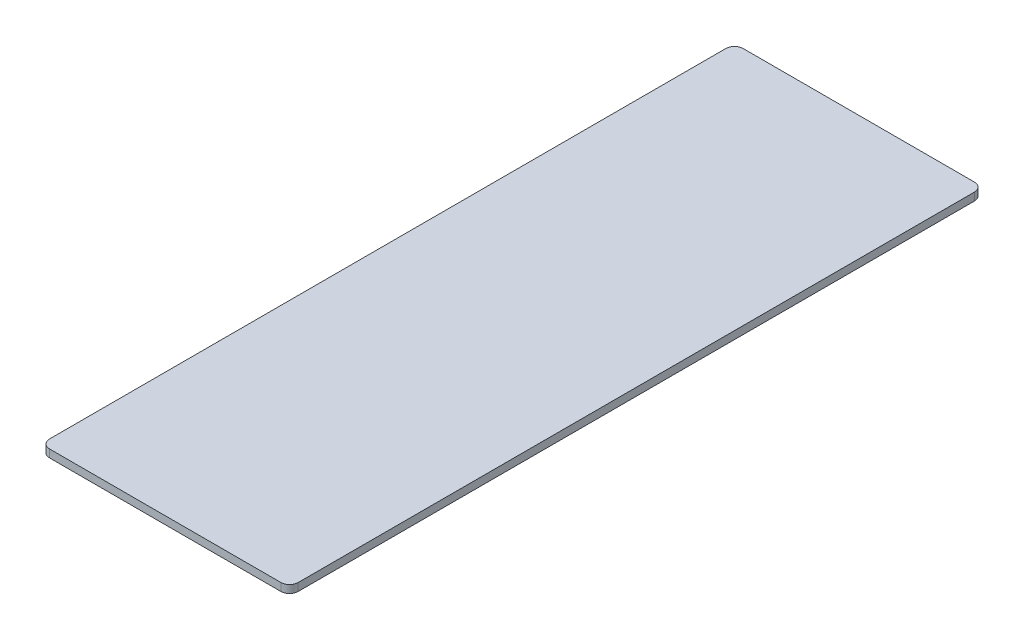
ISO-10303-21;
HEADER;
FILE_DESCRIPTION(('STEP AP214'),'2;1');
FILE_NAME('part.step','',(''),(''),'','','');
FILE_SCHEMA(('AUTOMOTIVE_DESIGN { 1 0 10303 214 1 1 1 1 }'));
ENDSEC;
DATA;
#1=APPLICATION_CONTEXT('core data for automotive mechanical design processes');
#2=APPLICATION_PROTOCOL_DEFINITION('international standard','automotive_design',2000,#1);
#3=PRODUCT_CONTEXT('',#1,'mechanical');
#4=PRODUCT('Part','Part','',(#3));
#5=PRODUCT_RELATED_PRODUCT_CATEGORY('part','',(#4));
#6=PRODUCT_DEFINITION_FORMATION('','',#4);
#7=PRODUCT_DEFINITION_CONTEXT('part definition',#1,'design');
#8=PRODUCT_DEFINITION('design','',#6,#7);
#9=PRODUCT_DEFINITION_SHAPE('','',#8);
#10=(LENGTH_UNIT() NAMED_UNIT(*) SI_UNIT(.MILLI.,.METRE.));
#11=(NAMED_UNIT(*) PLANE_ANGLE_UNIT() SI_UNIT($,.RADIAN.));
#12=(NAMED_UNIT(*) SI_UNIT($,.STERADIAN.) SOLID_ANGLE_UNIT());
#13=UNCERTAINTY_MEASURE_WITH_UNIT(LENGTH_MEASURE(1.E-05),#10,'distance_accuracy_value','');
#14=(GEOMETRIC_REPRESENTATION_CONTEXT(3) GLOBAL_UNCERTAINTY_ASSIGNED_CONTEXT((#13)) GLOBAL_UNIT_ASSIGNED_CONTEXT((#10,
#11,#12)) REPRESENTATION_CONTEXT('',''));
#15=CARTESIAN_POINT('',(0.,0.,0.));
#16=DIRECTION('',(0.,0.,1.));
#17=DIRECTION('',(1.,0.,0.));
#18=AXIS2_PLACEMENT_3D('',#15,#16,#17);
#19=CARTESIAN_POINT('',(0.,4.5,0.));
#20=DIRECTION('',(1.,0.,0.));
#21=DIRECTION('',(0.,0.,-1.));
#22=AXIS2_PLACEMENT_3D('',#19,#20,#21);
#23=PLANE('',#22);
#24=DIRECTION('',(0.,0.,1.));
#25=VECTOR('',#24,1.);
#26=CARTESIAN_POINT('',(0.,4.5,0.));
#27=LINE('',#26,#25);
#28=CARTESIAN_POINT('',(0.,4.5,-395.));
#29=VERTEX_POINT('',#28);
#30=CARTESIAN_POINT('',(0.,4.5,-5.));
#31=VERTEX_POINT('',#30);
#32=EDGE_CURVE('E133',#29,#31,#27,.T.);
#33=ORIENTED_EDGE('',*,*,#32,.F.);
#34=DIRECTION('',(0.,-1.,0.));
#35=VECTOR('',#34,1.);
#36=CARTESIAN_POINT('',(0.,4.5,-395.));
#37=LINE('',#36,#35);
#38=CARTESIAN_POINT('',(0.,0.,-395.));
#39=VERTEX_POINT('',#38);
#40=EDGE_CURVE('E117',#29,#39,#37,.T.);
#41=ORIENTED_EDGE('',*,*,#40,.T.);
#42=DIRECTION('',(0.,0.,1.));
#43=VECTOR('',#42,1.);
#44=CARTESIAN_POINT('',(0.,0.,0.));
#45=LINE('',#44,#43);
#46=CARTESIAN_POINT('',(0.,0.,-5.));
#47=VERTEX_POINT('',#46);
#48=EDGE_CURVE('E130',#39,#47,#45,.T.);
#49=ORIENTED_EDGE('',*,*,#48,.T.);
#50=DIRECTION('',(0.,-1.,0.));
#51=VECTOR('',#50,1.);
#52=CARTESIAN_POINT('',(0.,4.5,-5.));
#53=LINE('',#52,#51);
#54=EDGE_CURVE('E136',#47,#31,#53,.F.);
#55=ORIENTED_EDGE('',*,*,#54,.T.);
#56=EDGE_LOOP('',(#33,#41,#49,#55));
#57=FACE_BOUND('',#56,.T.);
#58=ADVANCED_FACE('F45',(#57),#23,.F.);
#59=CARTESIAN_POINT('',(0.,4.5,0.));
#60=DIRECTION('',(0.,0.,-1.));
#61=DIRECTION('',(-1.,0.,0.));
#62=AXIS2_PLACEMENT_3D('',#59,#60,#61);
#63=PLANE('',#62);
#64=DIRECTION('',(1.,0.,0.));
#65=VECTOR('',#64,1.);
#66=CARTESIAN_POINT('',(0.,4.5,0.));
#67=LINE('',#66,#65);
#68=CARTESIAN_POINT('',(5.,4.5,0.));
#69=VERTEX_POINT('',#68);
#70=CARTESIAN_POINT('',(138.4,4.5,0.));
#71=VERTEX_POINT('',#70);
#72=EDGE_CURVE('E191',#69,#71,#67,.T.);
#73=ORIENTED_EDGE('',*,*,#72,.F.);
#74=DIRECTION('',(0.,-1.,0.));
#75=VECTOR('',#74,1.);
#76=CARTESIAN_POINT('',(5.,4.5,0.));
#77=LINE('',#76,#75);
#78=CARTESIAN_POINT('',(5.,0.,0.));
#79=VERTEX_POINT('',#78);
#80=EDGE_CURVE('E11',#69,#79,#77,.T.);
#81=ORIENTED_EDGE('',*,*,#80,.T.);
#82=DIRECTION('',(1.,0.,0.));
#83=VECTOR('',#82,1.);
#84=CARTESIAN_POINT('',(0.,0.,0.));
#85=LINE('',#84,#83);
#86=CARTESIAN_POINT('',(138.4,0.,0.));
#87=VERTEX_POINT('',#86);
#88=EDGE_CURVE('E142',#79,#87,#85,.T.);
#89=ORIENTED_EDGE('',*,*,#88,.T.);
#90=DIRECTION('',(0.,-1.,0.));
#91=VECTOR('',#90,1.);
#92=CARTESIAN_POINT('',(138.4,4.5,0.));
#93=LINE('',#92,#91);
#94=EDGE_CURVE('E54',#87,#71,#93,.F.);
#95=ORIENTED_EDGE('',*,*,#94,.T.);
#96=EDGE_LOOP('',(#73,#81,#89,#95));
#97=FACE_BOUND('',#96,.T.);
#98=ADVANCED_FACE('F190',(#97),#63,.F.);
#99=CARTESIAN_POINT('',(143.4,4.5,0.));
#100=DIRECTION('',(-1.,0.,0.));
#101=DIRECTION('',(0.,0.,1.));
#102=AXIS2_PLACEMENT_3D('',#99,#100,#101);
#103=PLANE('',#102);
#104=DIRECTION('',(0.,0.,-1.));
#105=VECTOR('',#104,1.);
#106=CARTESIAN_POINT('',(143.4,0.,0.));
#107=LINE('',#106,#105);
#108=CARTESIAN_POINT('',(143.4,0.,-5.));
#109=VERTEX_POINT('',#108);
#110=CARTESIAN_POINT('',(143.4,0.,-395.));
#111=VERTEX_POINT('',#110);
#112=EDGE_CURVE('E146',#109,#111,#107,.T.);
#113=ORIENTED_EDGE('',*,*,#112,.T.);
#114=DIRECTION('',(0.,-1.,0.));
#115=VECTOR('',#114,1.);
#116=CARTESIAN_POINT('',(143.4,4.5,-395.));
#117=LINE('',#116,#115);
#118=CARTESIAN_POINT('',(143.4,4.5,-395.));
#119=VERTEX_POINT('',#118);
#120=EDGE_CURVE('E61',#111,#119,#117,.F.);
#121=ORIENTED_EDGE('',*,*,#120,.T.);
#122=DIRECTION('',(0.,0.,-1.));
#123=VECTOR('',#122,1.);
#124=CARTESIAN_POINT('',(143.4,4.5,0.));
#125=LINE('',#124,#123);
#126=CARTESIAN_POINT('',(143.4,4.5,-5.));
#127=VERTEX_POINT('',#126);
#128=EDGE_CURVE('E198',#127,#119,#125,.T.);
#129=ORIENTED_EDGE('',*,*,#128,.F.);
#130=DIRECTION('',(0.,-1.,0.));
#131=VECTOR('',#130,1.);
#132=CARTESIAN_POINT('',(143.4,4.5,-5.));
#133=LINE('',#132,#131);
#134=EDGE_CURVE('E181',#127,#109,#133,.T.);
#135=ORIENTED_EDGE('',*,*,#134,.T.);
#136=EDGE_LOOP('',(#113,#121,#129,#135));
#137=FACE_BOUND('',#136,.T.);
#138=ADVANCED_FACE('F202',(#137),#103,.F.);
#139=CARTESIAN_POINT('',(0.,4.5,-400.));
#140=DIRECTION('',(0.,0.,1.));
#141=DIRECTION('',(1.,0.,0.));
#142=AXIS2_PLACEMENT_3D('',#139,#140,#141);
#143=PLANE('',#142);
#144=DIRECTION('',(-1.,0.,0.));
#145=VECTOR('',#144,1.);
#146=CARTESIAN_POINT('',(0.,0.,-400.));
#147=LINE('',#146,#145);
#148=CARTESIAN_POINT('',(138.4,0.,-400.));
#149=VERTEX_POINT('',#148);
#150=CARTESIAN_POINT('',(5.,0.,-400.));
#151=VERTEX_POINT('',#150);
#152=EDGE_CURVE('E154',#149,#151,#147,.T.);
#153=ORIENTED_EDGE('',*,*,#152,.T.);
#154=DIRECTION('',(0.,-1.,0.));
#155=VECTOR('',#154,1.);
#156=CARTESIAN_POINT('',(5.,4.5,-400.));
#157=LINE('',#156,#155);
#158=CARTESIAN_POINT('',(5.,4.5,-400.));
#159=VERTEX_POINT('',#158);
#160=EDGE_CURVE('E118',#151,#159,#157,.F.);
#161=ORIENTED_EDGE('',*,*,#160,.T.);
#162=DIRECTION('',(-1.,0.,0.));
#163=VECTOR('',#162,1.);
#164=CARTESIAN_POINT('',(0.,4.5,-400.));
#165=LINE('',#164,#163);
#166=CARTESIAN_POINT('',(138.4,4.5,-400.));
#167=VERTEX_POINT('',#166);
#168=EDGE_CURVE('E149',#167,#159,#165,.T.);
#169=ORIENTED_EDGE('',*,*,#168,.F.);
#170=DIRECTION('',(0.,-1.,0.));
#171=VECTOR('',#170,1.);
#172=CARTESIAN_POINT('',(138.4,4.5,-400.));
#173=LINE('',#172,#171);
#174=EDGE_CURVE('E124',#167,#149,#173,.T.);
#175=ORIENTED_EDGE('',*,*,#174,.T.);
#176=EDGE_LOOP('',(#153,#161,#169,#175));
#177=FACE_BOUND('',#176,.T.);
#178=ADVANCED_FACE('F209',(#177),#143,.F.);
#179=CARTESIAN_POINT('',(0.,4.5,0.));
#180=DIRECTION('',(0.,-1.,0.));
#181=DIRECTION('',(0.,0.,-1.));
#182=AXIS2_PLACEMENT_3D('',#179,#180,#181);
#183=PLANE('',#182);
#184=ORIENTED_EDGE('',*,*,#168,.T.);
#185=CARTESIAN_POINT('',(5.,4.5,-395.));
#186=DIRECTION('',(0.,-1.,0.));
#187=DIRECTION('',(0.,0.,-1.));
#188=AXIS2_PLACEMENT_3D('',#185,#186,#187);
#189=CIRCLE('',#188,5.);
#190=EDGE_CURVE('E178',#159,#29,#189,.F.);
#191=ORIENTED_EDGE('',*,*,#190,.T.);
#192=ORIENTED_EDGE('',*,*,#32,.T.);
#193=CARTESIAN_POINT('',(5.,4.5,-5.));
#194=DIRECTION('',(0.,-1.,0.));
#195=DIRECTION('',(0.,0.,-1.));
#196=AXIS2_PLACEMENT_3D('',#193,#194,#195);
#197=CIRCLE('',#196,5.);
#198=EDGE_CURVE('E172',#31,#69,#197,.F.);
#199=ORIENTED_EDGE('',*,*,#198,.T.);
#200=ORIENTED_EDGE('',*,*,#72,.T.);
#201=CARTESIAN_POINT('',(138.4,4.5,-5.));
#202=DIRECTION('',(0.,-1.,0.));
#203=DIRECTION('',(0.,0.,-1.));
#204=AXIS2_PLACEMENT_3D('',#201,#202,#203);
#205=CIRCLE('',#204,5.);
#206=EDGE_CURVE('E68',#71,#127,#205,.F.);
#207=ORIENTED_EDGE('',*,*,#206,.T.);
#208=ORIENTED_EDGE('',*,*,#128,.T.);
#209=CARTESIAN_POINT('',(138.4,4.5,-395.));
#210=DIRECTION('',(0.,-1.,0.));
#211=DIRECTION('',(0.,0.,-1.));
#212=AXIS2_PLACEMENT_3D('',#209,#210,#211);
#213=CIRCLE('',#212,5.);
#214=EDGE_CURVE('E175',#119,#167,#213,.F.);
#215=ORIENTED_EDGE('',*,*,#214,.T.);
#216=EDGE_LOOP('',(#184,#191,#192,#199,#200,#207,#208,#215));
#217=FACE_BOUND('',#216,.T.);
#218=ADVANCED_FACE('F195',(#217),#183,.F.);
#219=CARTESIAN_POINT('',(0.,0.,0.));
#220=DIRECTION('',(0.,-1.,0.));
#221=DIRECTION('',(0.,0.,-1.));
#222=AXIS2_PLACEMENT_3D('',#219,#220,#221);
#223=PLANE('',#222);
#224=ORIENTED_EDGE('',*,*,#48,.F.);
#225=CARTESIAN_POINT('',(5.,0.,-395.));
#226=DIRECTION('',(0.,-1.,0.));
#227=DIRECTION('',(0.,0.,-1.));
#228=AXIS2_PLACEMENT_3D('',#225,#226,#227);
#229=CIRCLE('',#228,5.);
#230=EDGE_CURVE('E113',#39,#151,#229,.T.);
#231=ORIENTED_EDGE('',*,*,#230,.T.);
#232=ORIENTED_EDGE('',*,*,#152,.F.);
#233=CARTESIAN_POINT('',(138.4,0.,-395.));
#234=DIRECTION('',(0.,-1.,0.));
#235=DIRECTION('',(0.,0.,-1.));
#236=AXIS2_PLACEMENT_3D('',#233,#234,#235);
#237=CIRCLE('',#236,5.);
#238=EDGE_CURVE('E125',#149,#111,#237,.T.);
#239=ORIENTED_EDGE('',*,*,#238,.T.);
#240=ORIENTED_EDGE('',*,*,#112,.F.);
#241=CARTESIAN_POINT('',(138.4,0.,-5.));
#242=DIRECTION('',(0.,-1.,0.));
#243=DIRECTION('',(0.,0.,-1.));
#244=AXIS2_PLACEMENT_3D('',#241,#242,#243);
#245=CIRCLE('',#244,5.);
#246=EDGE_CURVE('E135',#109,#87,#245,.T.);
#247=ORIENTED_EDGE('',*,*,#246,.T.);
#248=ORIENTED_EDGE('',*,*,#88,.F.);
#249=CARTESIAN_POINT('',(5.,0.,-5.));
#250=DIRECTION('',(0.,-1.,0.));
#251=DIRECTION('',(0.,0.,-1.));
#252=AXIS2_PLACEMENT_3D('',#249,#250,#251);
#253=CIRCLE('',#252,5.);
#254=EDGE_CURVE('E140',#79,#47,#253,.T.);
#255=ORIENTED_EDGE('',*,*,#254,.T.);
#256=EDGE_LOOP('',(#224,#231,#232,#239,#240,#247,#248,#255));
#257=FACE_BOUND('',#256,.T.);
#258=ADVANCED_FACE('F138',(#257),#223,.T.);
#259=CARTESIAN_POINT('',(5.,4.5,-395.));
#260=DIRECTION('',(0.,-1.,0.));
#261=DIRECTION('',(0.,0.,-1.));
#262=AXIS2_PLACEMENT_3D('',#259,#260,#261);
#263=CYLINDRICAL_SURFACE('',#262,5.);
#264=ORIENTED_EDGE('',*,*,#190,.F.);
#265=ORIENTED_EDGE('',*,*,#160,.F.);
#266=ORIENTED_EDGE('',*,*,#230,.F.);
#267=ORIENTED_EDGE('',*,*,#40,.F.);
#268=EDGE_LOOP('',(#264,#265,#266,#267));
#269=FACE_BOUND('',#268,.T.);
#270=ADVANCED_FACE('F116',(#269),#263,.T.);
#271=CARTESIAN_POINT('',(138.4,4.5,-395.));
#272=DIRECTION('',(0.,-1.,0.));
#273=DIRECTION('',(0.,0.,-1.));
#274=AXIS2_PLACEMENT_3D('',#271,#272,#273);
#275=CYLINDRICAL_SURFACE('',#274,5.);
#276=ORIENTED_EDGE('',*,*,#214,.F.);
#277=ORIENTED_EDGE('',*,*,#120,.F.);
#278=ORIENTED_EDGE('',*,*,#238,.F.);
#279=ORIENTED_EDGE('',*,*,#174,.F.);
#280=EDGE_LOOP('',(#276,#277,#278,#279));
#281=FACE_BOUND('',#280,.T.);
#282=ADVANCED_FACE('F206',(#281),#275,.T.);
#283=CARTESIAN_POINT('',(5.,4.5,-5.));
#284=DIRECTION('',(0.,-1.,0.));
#285=DIRECTION('',(0.,0.,-1.));
#286=AXIS2_PLACEMENT_3D('',#283,#284,#285);
#287=CYLINDRICAL_SURFACE('',#286,5.);
#288=ORIENTED_EDGE('',*,*,#198,.F.);
#289=ORIENTED_EDGE('',*,*,#54,.F.);
#290=ORIENTED_EDGE('',*,*,#254,.F.);
#291=ORIENTED_EDGE('',*,*,#80,.F.);
#292=EDGE_LOOP('',(#288,#289,#290,#291));
#293=FACE_BOUND('',#292,.T.);
#294=ADVANCED_FACE('F215',(#293),#287,.T.);
#295=CARTESIAN_POINT('',(138.4,4.5,-5.));
#296=DIRECTION('',(0.,-1.,0.));
#297=DIRECTION('',(0.,0.,-1.));
#298=AXIS2_PLACEMENT_3D('',#295,#296,#297);
#299=CYLINDRICAL_SURFACE('',#298,5.);
#300=ORIENTED_EDGE('',*,*,#206,.F.);
#301=ORIENTED_EDGE('',*,*,#94,.F.);
#302=ORIENTED_EDGE('',*,*,#246,.F.);
#303=ORIENTED_EDGE('',*,*,#134,.F.);
#304=EDGE_LOOP('',(#300,#301,#302,#303));
#305=FACE_BOUND('',#304,.T.);
#306=ADVANCED_FACE('F47',(#305),#299,.T.);
#307=CLOSED_SHELL('',(#58,#98,#138,#178,#218,#258,#270,#282,#294,#306));
#308=MANIFOLD_SOLID_BREP('B2',#307);
#309=ADVANCED_BREP_SHAPE_REPRESENTATION('',(#18,#308),#14);
#310=SHAPE_DEFINITION_REPRESENTATION(#9,#309);
ENDSEC;
END-ISO-10303-21;
